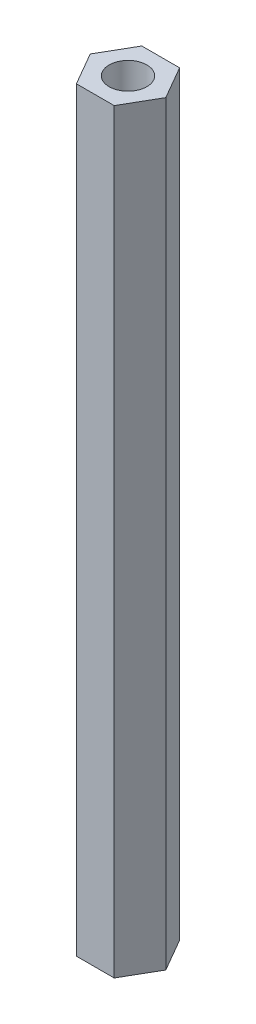
ISO-10303-21;
HEADER;
FILE_DESCRIPTION(('STEP AP214'),'2;1');
FILE_NAME('part.step','',(''),(''),'','','');
FILE_SCHEMA(('AUTOMOTIVE_DESIGN { 1 0 10303 214 1 1 1 1 }'));
ENDSEC;
DATA;
#1=APPLICATION_CONTEXT('core data for automotive mechanical design processes');
#2=APPLICATION_PROTOCOL_DEFINITION('international standard','automotive_design',2000,#1);
#3=PRODUCT_CONTEXT('',#1,'mechanical');
#4=PRODUCT('Part','Part','',(#3));
#5=PRODUCT_RELATED_PRODUCT_CATEGORY('part','',(#4));
#6=PRODUCT_DEFINITION_FORMATION('','',#4);
#7=PRODUCT_DEFINITION_CONTEXT('part definition',#1,'design');
#8=PRODUCT_DEFINITION('design','',#6,#7);
#9=PRODUCT_DEFINITION_SHAPE('','',#8);
#10=(LENGTH_UNIT() NAMED_UNIT(*) SI_UNIT(.MILLI.,.METRE.));
#11=(NAMED_UNIT(*) PLANE_ANGLE_UNIT() SI_UNIT($,.RADIAN.));
#12=(NAMED_UNIT(*) SI_UNIT($,.STERADIAN.) SOLID_ANGLE_UNIT());
#13=UNCERTAINTY_MEASURE_WITH_UNIT(LENGTH_MEASURE(1.E-05),#10,'distance_accuracy_value','');
#14=(GEOMETRIC_REPRESENTATION_CONTEXT(3) GLOBAL_UNCERTAINTY_ASSIGNED_CONTEXT((#13)) GLOBAL_UNIT_ASSIGNED_CONTEXT((#10,
#11,#12)) REPRESENTATION_CONTEXT('',''));
#15=CARTESIAN_POINT('',(0.,0.,0.));
#16=DIRECTION('',(0.,0.,1.));
#17=DIRECTION('',(1.,0.,0.));
#18=AXIS2_PLACEMENT_3D('',#15,#16,#17);
#19=CARTESIAN_POINT('',(0.,60.,0.));
#20=DIRECTION('',(0.,1.,0.));
#21=DIRECTION('',(0.,0.,1.));
#22=AXIS2_PLACEMENT_3D('',#19,#20,#21);
#23=PLANE('',#22);
#24=DIRECTION('',(0.499999999999995,0.,-0.866025403784442));
#25=VECTOR('',#24,1.);
#26=CARTESIAN_POINT('',(1.50000000000003,60.,2.5980762113533));
#27=LINE('',#26,#25);
#28=CARTESIAN_POINT('',(1.50000000000003,60.,2.5980762113533));
#29=VERTEX_POINT('',#28);
#30=CARTESIAN_POINT('',(3.,60.,0.));
#31=VERTEX_POINT('',#30);
#32=EDGE_CURVE('E130',#29,#31,#27,.T.);
#33=ORIENTED_EDGE('',*,*,#32,.T.);
#34=DIRECTION('',(-0.500000000000001,0.,-0.866025403784438));
#35=VECTOR('',#34,1.);
#36=CARTESIAN_POINT('',(3.,60.,0.));
#37=LINE('',#36,#35);
#38=CARTESIAN_POINT('',(1.49999999999999,60.,-2.59807621135332));
#39=VERTEX_POINT('',#38);
#40=EDGE_CURVE('E88',#31,#39,#37,.T.);
#41=ORIENTED_EDGE('',*,*,#40,.T.);
#42=DIRECTION('',(-1.,0.,0.));
#43=VECTOR('',#42,1.);
#44=CARTESIAN_POINT('',(1.49999999999999,60.,-2.59807621135332));
#45=LINE('',#44,#43);
#46=CARTESIAN_POINT('',(-1.50000000000001,60.,-2.59807621135331));
#47=VERTEX_POINT('',#46);
#48=EDGE_CURVE('E101',#39,#47,#45,.T.);
#49=ORIENTED_EDGE('',*,*,#48,.T.);
#50=DIRECTION('',(-0.499999999999995,0.,0.866025403784441));
#51=VECTOR('',#50,1.);
#52=CARTESIAN_POINT('',(-1.50000000000001,60.,-2.59807621135331));
#53=LINE('',#52,#51);
#54=CARTESIAN_POINT('',(-3.,60.,0.));
#55=VERTEX_POINT('',#54);
#56=EDGE_CURVE('E95',#47,#55,#53,.T.);
#57=ORIENTED_EDGE('',*,*,#56,.T.);
#58=DIRECTION('',(0.500000000000007,0.,0.866025403784434));
#59=VECTOR('',#58,1.);
#60=CARTESIAN_POINT('',(-3.,60.,0.));
#61=LINE('',#60,#59);
#62=CARTESIAN_POINT('',(-1.49999999999998,60.,2.59807621135333));
#63=VERTEX_POINT('',#62);
#64=EDGE_CURVE('E99',#55,#63,#61,.T.);
#65=ORIENTED_EDGE('',*,*,#64,.T.);
#66=DIRECTION('',(1.,0.,0.));
#67=VECTOR('',#66,1.);
#68=CARTESIAN_POINT('',(-1.49999999999998,60.,2.59807621135333));
#69=LINE('',#68,#67);
#70=EDGE_CURVE('E51',#63,#29,#69,.T.);
#71=ORIENTED_EDGE('',*,*,#70,.T.);
#72=EDGE_LOOP('',(#33,#41,#49,#57,#65,#71));
#73=FACE_BOUND('',#72,.T.);
#74=CARTESIAN_POINT('',(0.,60.,0.));
#75=DIRECTION('',(0.,1.,0.));
#76=DIRECTION('',(0.,0.,1.));
#77=AXIS2_PLACEMENT_3D('',#74,#75,#76);
#78=CIRCLE('',#77,1.5);
#79=CARTESIAN_POINT('',(0.,60.,1.5));
#80=VERTEX_POINT('',#79);
#81=EDGE_CURVE('E123',#80,#80,#78,.T.);
#82=ORIENTED_EDGE('',*,*,#81,.F.);
#83=EDGE_LOOP('',(#82));
#84=FACE_BOUND('',#83,.T.);
#85=ADVANCED_FACE('F34',(#73,#84),#23,.T.);
#86=CARTESIAN_POINT('',(0.,0.,0.));
#87=DIRECTION('',(0.,1.,0.));
#88=DIRECTION('',(0.,0.,1.));
#89=AXIS2_PLACEMENT_3D('',#86,#87,#88);
#90=PLANE('',#89);
#91=DIRECTION('',(0.499999999999995,0.,-0.866025403784442));
#92=VECTOR('',#91,1.);
#93=CARTESIAN_POINT('',(1.50000000000003,0.,2.5980762113533));
#94=LINE('',#93,#92);
#95=CARTESIAN_POINT('',(1.50000000000003,0.,2.5980762113533));
#96=VERTEX_POINT('',#95);
#97=CARTESIAN_POINT('',(3.,0.,0.));
#98=VERTEX_POINT('',#97);
#99=EDGE_CURVE('E119',#96,#98,#94,.T.);
#100=ORIENTED_EDGE('',*,*,#99,.F.);
#101=DIRECTION('',(1.,0.,0.));
#102=VECTOR('',#101,1.);
#103=CARTESIAN_POINT('',(-1.49999999999998,0.,2.59807621135333));
#104=LINE('',#103,#102);
#105=CARTESIAN_POINT('',(-1.49999999999998,0.,2.59807621135333));
#106=VERTEX_POINT('',#105);
#107=EDGE_CURVE('E80',#106,#96,#104,.T.);
#108=ORIENTED_EDGE('',*,*,#107,.F.);
#109=DIRECTION('',(0.500000000000007,0.,0.866025403784434));
#110=VECTOR('',#109,1.);
#111=CARTESIAN_POINT('',(-3.,0.,0.));
#112=LINE('',#111,#110);
#113=CARTESIAN_POINT('',(-3.,0.,0.));
#114=VERTEX_POINT('',#113);
#115=EDGE_CURVE('E74',#114,#106,#112,.T.);
#116=ORIENTED_EDGE('',*,*,#115,.F.);
#117=DIRECTION('',(-0.499999999999995,0.,0.866025403784441));
#118=VECTOR('',#117,1.);
#119=CARTESIAN_POINT('',(-1.50000000000001,0.,-2.59807621135331));
#120=LINE('',#119,#118);
#121=CARTESIAN_POINT('',(-1.50000000000001,0.,-2.59807621135331));
#122=VERTEX_POINT('',#121);
#123=EDGE_CURVE('E109',#122,#114,#120,.T.);
#124=ORIENTED_EDGE('',*,*,#123,.F.);
#125=DIRECTION('',(-1.,0.,0.));
#126=VECTOR('',#125,1.);
#127=CARTESIAN_POINT('',(1.49999999999999,0.,-2.59807621135332));
#128=LINE('',#127,#126);
#129=CARTESIAN_POINT('',(1.49999999999999,0.,-2.59807621135332));
#130=VERTEX_POINT('',#129);
#131=EDGE_CURVE('E125',#130,#122,#128,.T.);
#132=ORIENTED_EDGE('',*,*,#131,.F.);
#133=DIRECTION('',(-0.500000000000001,0.,-0.866025403784438));
#134=VECTOR('',#133,1.);
#135=CARTESIAN_POINT('',(3.,0.,0.));
#136=LINE('',#135,#134);
#137=EDGE_CURVE('E122',#98,#130,#136,.T.);
#138=ORIENTED_EDGE('',*,*,#137,.F.);
#139=EDGE_LOOP('',(#100,#108,#116,#124,#132,#138));
#140=FACE_BOUND('',#139,.T.);
#141=CARTESIAN_POINT('',(0.,0.,0.));
#142=DIRECTION('',(0.,1.,0.));
#143=DIRECTION('',(0.,0.,1.));
#144=AXIS2_PLACEMENT_3D('',#141,#142,#143);
#145=CIRCLE('',#144,1.5);
#146=CARTESIAN_POINT('',(0.,0.,1.5));
#147=VERTEX_POINT('',#146);
#148=EDGE_CURVE('E223',#147,#147,#145,.T.);
#149=ORIENTED_EDGE('',*,*,#148,.T.);
#150=EDGE_LOOP('',(#149));
#151=FACE_BOUND('',#150,.T.);
#152=ADVANCED_FACE('F139',(#140,#151),#90,.F.);
#153=CARTESIAN_POINT('',(1.50000000000003,60.,2.5980762113533));
#154=DIRECTION('',(-0.866025403784441,0.,-0.499999999999995));
#155=DIRECTION('',(-0.499999999999995,0.,0.866025403784442));
#156=AXIS2_PLACEMENT_3D('',#153,#154,#155);
#157=PLANE('',#156);
#158=ORIENTED_EDGE('',*,*,#99,.T.);
#159=DIRECTION('',(0.,-1.,0.));
#160=VECTOR('',#159,1.);
#161=CARTESIAN_POINT('',(3.,60.,0.));
#162=LINE('',#161,#160);
#163=EDGE_CURVE('E11',#31,#98,#162,.T.);
#164=ORIENTED_EDGE('',*,*,#163,.F.);
#165=ORIENTED_EDGE('',*,*,#32,.F.);
#166=DIRECTION('',(0.,-1.,0.));
#167=VECTOR('',#166,1.);
#168=CARTESIAN_POINT('',(1.50000000000003,60.,2.5980762113533));
#169=LINE('',#168,#167);
#170=EDGE_CURVE('E115',#29,#96,#169,.T.);
#171=ORIENTED_EDGE('',*,*,#170,.T.);
#172=EDGE_LOOP('',(#158,#164,#165,#171));
#173=FACE_BOUND('',#172,.T.);
#174=ADVANCED_FACE('F36',(#173),#157,.F.);
#175=CARTESIAN_POINT('',(3.,60.,0.));
#176=DIRECTION('',(-0.866025403784438,0.,0.500000000000001));
#177=DIRECTION('',(0.500000000000001,0.,0.866025403784438));
#178=AXIS2_PLACEMENT_3D('',#175,#176,#177);
#179=PLANE('',#178);
#180=ORIENTED_EDGE('',*,*,#137,.T.);
#181=DIRECTION('',(0.,-1.,0.));
#182=VECTOR('',#181,1.);
#183=CARTESIAN_POINT('',(1.49999999999999,60.,-2.59807621135332));
#184=LINE('',#183,#182);
#185=EDGE_CURVE('E43',#39,#130,#184,.T.);
#186=ORIENTED_EDGE('',*,*,#185,.F.);
#187=ORIENTED_EDGE('',*,*,#40,.F.);
#188=ORIENTED_EDGE('',*,*,#163,.T.);
#189=EDGE_LOOP('',(#180,#186,#187,#188));
#190=FACE_BOUND('',#189,.T.);
#191=ADVANCED_FACE('F164',(#190),#179,.F.);
#192=CARTESIAN_POINT('',(1.49999999999999,60.,-2.59807621135332));
#193=DIRECTION('',(0.,0.,1.));
#194=DIRECTION('',(1.,0.,0.));
#195=AXIS2_PLACEMENT_3D('',#192,#193,#194);
#196=PLANE('',#195);
#197=ORIENTED_EDGE('',*,*,#131,.T.);
#198=DIRECTION('',(0.,-1.,0.));
#199=VECTOR('',#198,1.);
#200=CARTESIAN_POINT('',(-1.50000000000001,60.,-2.59807621135331));
#201=LINE('',#200,#199);
#202=EDGE_CURVE('E110',#47,#122,#201,.T.);
#203=ORIENTED_EDGE('',*,*,#202,.F.);
#204=ORIENTED_EDGE('',*,*,#48,.F.);
#205=ORIENTED_EDGE('',*,*,#185,.T.);
#206=EDGE_LOOP('',(#197,#203,#204,#205));
#207=FACE_BOUND('',#206,.T.);
#208=ADVANCED_FACE('F136',(#207),#196,.F.);
#209=CARTESIAN_POINT('',(-1.50000000000001,60.,-2.59807621135331));
#210=DIRECTION('',(0.866025403784441,0.,0.499999999999995));
#211=DIRECTION('',(0.499999999999995,0.,-0.866025403784442));
#212=AXIS2_PLACEMENT_3D('',#209,#210,#211);
#213=PLANE('',#212);
#214=ORIENTED_EDGE('',*,*,#123,.T.);
#215=DIRECTION('',(0.,-1.,0.));
#216=VECTOR('',#215,1.);
#217=CARTESIAN_POINT('',(-3.,60.,0.));
#218=LINE('',#217,#216);
#219=EDGE_CURVE('E106',#55,#114,#218,.T.);
#220=ORIENTED_EDGE('',*,*,#219,.F.);
#221=ORIENTED_EDGE('',*,*,#56,.F.);
#222=ORIENTED_EDGE('',*,*,#202,.T.);
#223=EDGE_LOOP('',(#214,#220,#221,#222));
#224=FACE_BOUND('',#223,.T.);
#225=ADVANCED_FACE('F107',(#224),#213,.F.);
#226=CARTESIAN_POINT('',(-3.,60.,0.));
#227=DIRECTION('',(0.866025403784435,0.,-0.500000000000007));
#228=DIRECTION('',(-0.500000000000007,0.,-0.866025403784435));
#229=AXIS2_PLACEMENT_3D('',#226,#227,#228);
#230=PLANE('',#229);
#231=ORIENTED_EDGE('',*,*,#115,.T.);
#232=DIRECTION('',(0.,-1.,0.));
#233=VECTOR('',#232,1.);
#234=CARTESIAN_POINT('',(-1.49999999999998,60.,2.59807621135333));
#235=LINE('',#234,#233);
#236=EDGE_CURVE('E111',#63,#106,#235,.T.);
#237=ORIENTED_EDGE('',*,*,#236,.F.);
#238=ORIENTED_EDGE('',*,*,#64,.F.);
#239=ORIENTED_EDGE('',*,*,#219,.T.);
#240=EDGE_LOOP('',(#231,#237,#238,#239));
#241=FACE_BOUND('',#240,.T.);
#242=ADVANCED_FACE('F113',(#241),#230,.F.);
#243=CARTESIAN_POINT('',(-1.49999999999998,60.,2.59807621135333));
#244=DIRECTION('',(0.,0.,-1.));
#245=DIRECTION('',(-1.,0.,0.));
#246=AXIS2_PLACEMENT_3D('',#243,#244,#245);
#247=PLANE('',#246);
#248=ORIENTED_EDGE('',*,*,#107,.T.);
#249=ORIENTED_EDGE('',*,*,#170,.F.);
#250=ORIENTED_EDGE('',*,*,#70,.F.);
#251=ORIENTED_EDGE('',*,*,#236,.T.);
#252=EDGE_LOOP('',(#248,#249,#250,#251));
#253=FACE_BOUND('',#252,.T.);
#254=ADVANCED_FACE('F144',(#253),#247,.F.);
#255=CARTESIAN_POINT('',(0.,60.,0.));
#256=DIRECTION('',(0.,-1.,0.));
#257=DIRECTION('',(0.,0.,-1.));
#258=AXIS2_PLACEMENT_3D('',#255,#256,#257);
#259=CYLINDRICAL_SURFACE('',#258,1.5);
#260=ORIENTED_EDGE('',*,*,#81,.T.);
#261=EDGE_LOOP('',(#260));
#262=FACE_BOUND('',#261,.T.);
#263=ORIENTED_EDGE('',*,*,#148,.F.);
#264=EDGE_LOOP('',(#263));
#265=FACE_BOUND('',#264,.T.);
#266=ADVANCED_FACE('F146',(#262,#265),#259,.F.);
#267=CLOSED_SHELL('',(#85,#152,#174,#191,#208,#225,#242,#254,#266));
#268=MANIFOLD_SOLID_BREP('B2',#267);
#269=ADVANCED_BREP_SHAPE_REPRESENTATION('',(#18,#268),#14);
#270=SHAPE_DEFINITION_REPRESENTATION(#9,#269);
ENDSEC;
END-ISO-10303-21;
